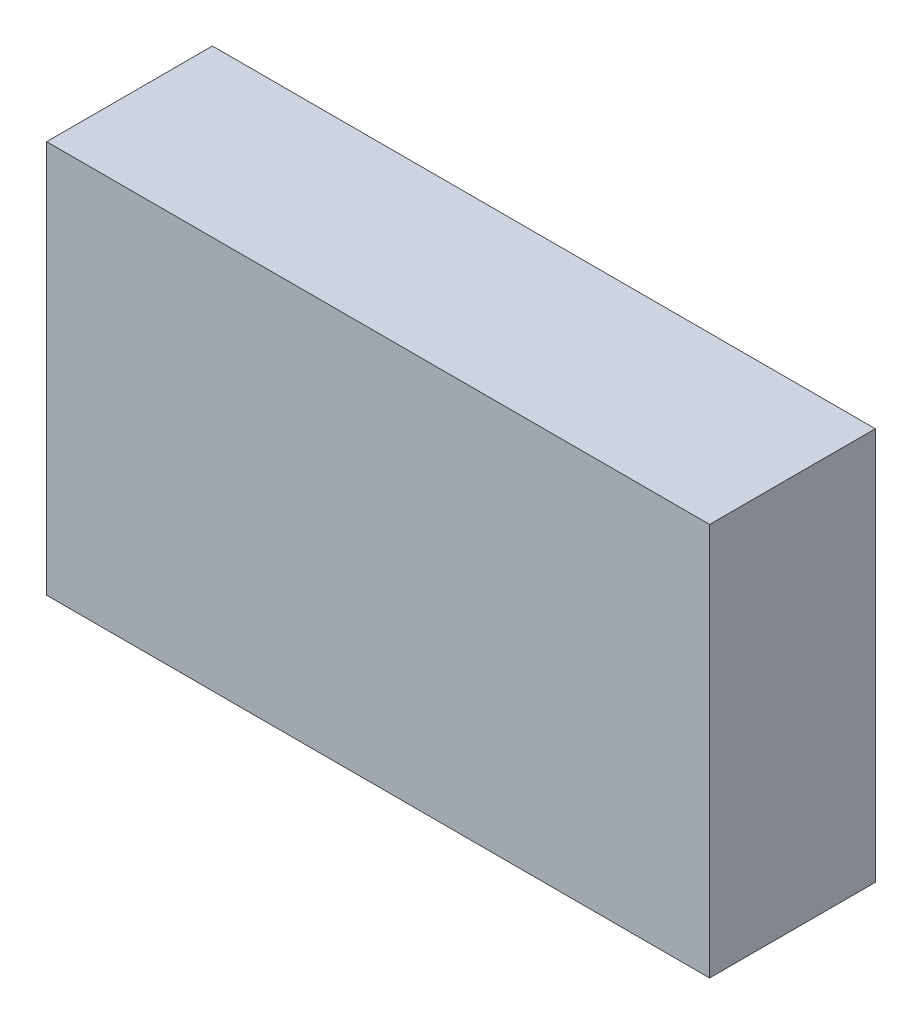
ISO-10303-21;
HEADER;
FILE_DESCRIPTION(('STEP AP214'),'2;1');
FILE_NAME('part.step','',(''),(''),'','','');
FILE_SCHEMA(('AUTOMOTIVE_DESIGN { 1 0 10303 214 1 1 1 1 }'));
ENDSEC;
DATA;
#1=APPLICATION_CONTEXT('core data for automotive mechanical design processes');
#2=APPLICATION_PROTOCOL_DEFINITION('international standard','automotive_design',2000,#1);
#3=PRODUCT_CONTEXT('',#1,'mechanical');
#4=PRODUCT('Part','Part','',(#3));
#5=PRODUCT_RELATED_PRODUCT_CATEGORY('part','',(#4));
#6=PRODUCT_DEFINITION_FORMATION('','',#4);
#7=PRODUCT_DEFINITION_CONTEXT('part definition',#1,'design');
#8=PRODUCT_DEFINITION('design','',#6,#7);
#9=PRODUCT_DEFINITION_SHAPE('','',#8);
#10=(LENGTH_UNIT() NAMED_UNIT(*) SI_UNIT(.MILLI.,.METRE.));
#11=(NAMED_UNIT(*) PLANE_ANGLE_UNIT() SI_UNIT($,.RADIAN.));
#12=(NAMED_UNIT(*) SI_UNIT($,.STERADIAN.) SOLID_ANGLE_UNIT());
#13=UNCERTAINTY_MEASURE_WITH_UNIT(LENGTH_MEASURE(1.E-05),#10,'distance_accuracy_value','');
#14=(GEOMETRIC_REPRESENTATION_CONTEXT(3) GLOBAL_UNCERTAINTY_ASSIGNED_CONTEXT((#13)) GLOBAL_UNIT_ASSIGNED_CONTEXT((#10,
#11,#12)) REPRESENTATION_CONTEXT('',''));
#15=CARTESIAN_POINT('',(0.,0.,0.));
#16=DIRECTION('',(0.,0.,1.));
#17=DIRECTION('',(1.,0.,0.));
#18=AXIS2_PLACEMENT_3D('',#15,#16,#17);
#19=CARTESIAN_POINT('',(0.,0.,-10.));
#20=DIRECTION('',(-1.,0.,0.));
#21=DIRECTION('',(0.,0.,1.));
#22=AXIS2_PLACEMENT_3D('',#19,#20,#21);
#23=PLANE('',#22);
#24=DIRECTION('',(0.,-1.,0.));
#25=VECTOR('',#24,1.);
#26=CARTESIAN_POINT('',(0.,0.,0.));
#27=LINE('',#26,#25);
#28=CARTESIAN_POINT('',(0.,23.7,0.));
#29=VERTEX_POINT('',#28);
#30=CARTESIAN_POINT('',(0.,0.,0.));
#31=VERTEX_POINT('',#30);
#32=EDGE_CURVE('E107',#29,#31,#27,.T.);
#33=ORIENTED_EDGE('',*,*,#32,.F.);
#34=DIRECTION('',(0.,0.,1.));
#35=VECTOR('',#34,1.);
#36=CARTESIAN_POINT('',(0.,23.7,-10.));
#37=LINE('',#36,#35);
#38=CARTESIAN_POINT('',(0.,23.7,-10.));
#39=VERTEX_POINT('',#38);
#40=EDGE_CURVE('E11',#39,#29,#37,.T.);
#41=ORIENTED_EDGE('',*,*,#40,.F.);
#42=DIRECTION('',(0.,-1.,0.));
#43=VECTOR('',#42,1.);
#44=CARTESIAN_POINT('',(0.,0.,-10.));
#45=LINE('',#44,#43);
#46=CARTESIAN_POINT('',(0.,0.,-10.));
#47=VERTEX_POINT('',#46);
#48=EDGE_CURVE('E102',#39,#47,#45,.T.);
#49=ORIENTED_EDGE('',*,*,#48,.T.);
#50=DIRECTION('',(0.,0.,1.));
#51=VECTOR('',#50,1.);
#52=CARTESIAN_POINT('',(0.,0.,-10.));
#53=LINE('',#52,#51);
#54=EDGE_CURVE('E46',#47,#31,#53,.T.);
#55=ORIENTED_EDGE('',*,*,#54,.T.);
#56=EDGE_LOOP('',(#33,#41,#49,#55));
#57=FACE_BOUND('',#56,.T.);
#58=ADVANCED_FACE('F43',(#57),#23,.T.);
#59=CARTESIAN_POINT('',(0.,23.7,-10.));
#60=DIRECTION('',(0.,1.,0.));
#61=DIRECTION('',(0.,0.,1.));
#62=AXIS2_PLACEMENT_3D('',#59,#60,#61);
#63=PLANE('',#62);
#64=DIRECTION('',(-1.,0.,0.));
#65=VECTOR('',#64,1.);
#66=CARTESIAN_POINT('',(0.,23.7,0.));
#67=LINE('',#66,#65);
#68=CARTESIAN_POINT('',(40.,23.7,0.));
#69=VERTEX_POINT('',#68);
#70=EDGE_CURVE('E104',#69,#29,#67,.T.);
#71=ORIENTED_EDGE('',*,*,#70,.F.);
#72=DIRECTION('',(0.,0.,1.));
#73=VECTOR('',#72,1.);
#74=CARTESIAN_POINT('',(40.,23.7,-10.));
#75=LINE('',#74,#73);
#76=CARTESIAN_POINT('',(40.,23.7,-10.));
#77=VERTEX_POINT('',#76);
#78=EDGE_CURVE('E55',#77,#69,#75,.T.);
#79=ORIENTED_EDGE('',*,*,#78,.F.);
#80=DIRECTION('',(-1.,0.,0.));
#81=VECTOR('',#80,1.);
#82=CARTESIAN_POINT('',(0.,23.7,-10.));
#83=LINE('',#82,#81);
#84=EDGE_CURVE('E97',#77,#39,#83,.T.);
#85=ORIENTED_EDGE('',*,*,#84,.T.);
#86=ORIENTED_EDGE('',*,*,#40,.T.);
#87=EDGE_LOOP('',(#71,#79,#85,#86));
#88=FACE_BOUND('',#87,.T.);
#89=ADVANCED_FACE('F117',(#88),#63,.T.);
#90=CARTESIAN_POINT('',(40.,0.,-10.));
#91=DIRECTION('',(1.,0.,0.));
#92=DIRECTION('',(0.,0.,-1.));
#93=AXIS2_PLACEMENT_3D('',#90,#91,#92);
#94=PLANE('',#93);
#95=DIRECTION('',(0.,1.,0.));
#96=VECTOR('',#95,1.);
#97=CARTESIAN_POINT('',(40.,0.,0.));
#98=LINE('',#97,#96);
#99=CARTESIAN_POINT('',(40.,0.,0.));
#100=VERTEX_POINT('',#99);
#101=EDGE_CURVE('E93',#100,#69,#98,.T.);
#102=ORIENTED_EDGE('',*,*,#101,.F.);
#103=DIRECTION('',(0.,0.,1.));
#104=VECTOR('',#103,1.);
#105=CARTESIAN_POINT('',(40.,0.,-10.));
#106=LINE('',#105,#104);
#107=CARTESIAN_POINT('',(40.,0.,-10.));
#108=VERTEX_POINT('',#107);
#109=EDGE_CURVE('E88',#108,#100,#106,.T.);
#110=ORIENTED_EDGE('',*,*,#109,.F.);
#111=DIRECTION('',(0.,1.,0.));
#112=VECTOR('',#111,1.);
#113=CARTESIAN_POINT('',(40.,0.,-10.));
#114=LINE('',#113,#112);
#115=EDGE_CURVE('E91',#108,#77,#114,.T.);
#116=ORIENTED_EDGE('',*,*,#115,.T.);
#117=ORIENTED_EDGE('',*,*,#78,.T.);
#118=EDGE_LOOP('',(#102,#110,#116,#117));
#119=FACE_BOUND('',#118,.T.);
#120=ADVANCED_FACE('F89',(#119),#94,.T.);
#121=CARTESIAN_POINT('',(0.,0.,-10.));
#122=DIRECTION('',(0.,-1.,0.));
#123=DIRECTION('',(0.,0.,-1.));
#124=AXIS2_PLACEMENT_3D('',#121,#122,#123);
#125=PLANE('',#124);
#126=DIRECTION('',(1.,0.,0.));
#127=VECTOR('',#126,1.);
#128=CARTESIAN_POINT('',(0.,0.,0.));
#129=LINE('',#128,#127);
#130=EDGE_CURVE('E110',#31,#100,#129,.T.);
#131=ORIENTED_EDGE('',*,*,#130,.F.);
#132=ORIENTED_EDGE('',*,*,#54,.F.);
#133=DIRECTION('',(1.,0.,0.));
#134=VECTOR('',#133,1.);
#135=CARTESIAN_POINT('',(0.,0.,-10.));
#136=LINE('',#135,#134);
#137=EDGE_CURVE('E100',#47,#108,#136,.T.);
#138=ORIENTED_EDGE('',*,*,#137,.T.);
#139=ORIENTED_EDGE('',*,*,#109,.T.);
#140=EDGE_LOOP('',(#131,#132,#138,#139));
#141=FACE_BOUND('',#140,.T.);
#142=ADVANCED_FACE('F99',(#141),#125,.T.);
#143=CARTESIAN_POINT('',(0.,0.,-10.));
#144=DIRECTION('',(0.,0.,-1.));
#145=DIRECTION('',(-1.,0.,0.));
#146=AXIS2_PLACEMENT_3D('',#143,#144,#145);
#147=PLANE('',#146);
#148=ORIENTED_EDGE('',*,*,#48,.F.);
#149=ORIENTED_EDGE('',*,*,#84,.F.);
#150=ORIENTED_EDGE('',*,*,#115,.F.);
#151=ORIENTED_EDGE('',*,*,#137,.F.);
#152=EDGE_LOOP('',(#148,#149,#150,#151));
#153=FACE_BOUND('',#152,.T.);
#154=ADVANCED_FACE('F96',(#153),#147,.T.);
#155=CARTESIAN_POINT('',(0.,0.,0.));
#156=DIRECTION('',(0.,0.,-1.));
#157=DIRECTION('',(-1.,0.,0.));
#158=AXIS2_PLACEMENT_3D('',#155,#156,#157);
#159=PLANE('',#158);
#160=ORIENTED_EDGE('',*,*,#32,.T.);
#161=ORIENTED_EDGE('',*,*,#130,.T.);
#162=ORIENTED_EDGE('',*,*,#101,.T.);
#163=ORIENTED_EDGE('',*,*,#70,.T.);
#164=EDGE_LOOP('',(#160,#161,#162,#163));
#165=FACE_BOUND('',#164,.T.);
#166=ADVANCED_FACE('F116',(#165),#159,.F.);
#167=CLOSED_SHELL('',(#58,#89,#120,#142,#154,#166));
#168=MANIFOLD_SOLID_BREP('B2',#167);
#169=ADVANCED_BREP_SHAPE_REPRESENTATION('',(#18,#168),#14);
#170=SHAPE_DEFINITION_REPRESENTATION(#9,#169);
ENDSEC;
END-ISO-10303-21;
